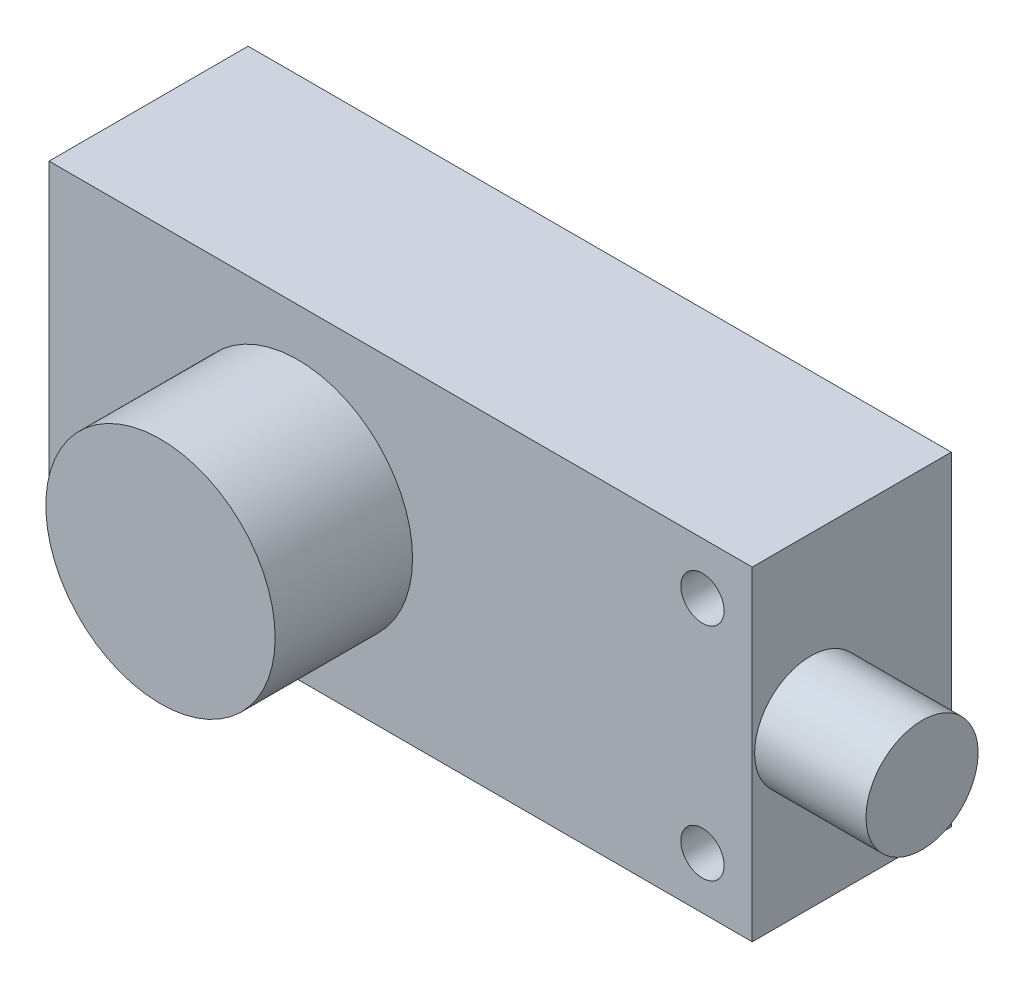
ISO-10303-21;
HEADER;
FILE_DESCRIPTION(('STEP AP214'),'2;1');
FILE_NAME('part.step','',(''),(''),'','','');
FILE_SCHEMA(('AUTOMOTIVE_DESIGN { 1 0 10303 214 1 1 1 1 }'));
ENDSEC;
DATA;
#1=APPLICATION_CONTEXT('core data for automotive mechanical design processes');
#2=APPLICATION_PROTOCOL_DEFINITION('international standard','automotive_design',2000,#1);
#3=PRODUCT_CONTEXT('',#1,'mechanical');
#4=PRODUCT('Part','Part','',(#3));
#5=PRODUCT_RELATED_PRODUCT_CATEGORY('part','',(#4));
#6=PRODUCT_DEFINITION_FORMATION('','',#4);
#7=PRODUCT_DEFINITION_CONTEXT('part definition',#1,'design');
#8=PRODUCT_DEFINITION('design','',#6,#7);
#9=PRODUCT_DEFINITION_SHAPE('','',#8);
#10=(LENGTH_UNIT() NAMED_UNIT(*) SI_UNIT(.MILLI.,.METRE.));
#11=(NAMED_UNIT(*) PLANE_ANGLE_UNIT() SI_UNIT($,.RADIAN.));
#12=(NAMED_UNIT(*) SI_UNIT($,.STERADIAN.) SOLID_ANGLE_UNIT());
#13=UNCERTAINTY_MEASURE_WITH_UNIT(LENGTH_MEASURE(1.E-05),#10,'distance_accuracy_value','');
#14=(GEOMETRIC_REPRESENTATION_CONTEXT(3) GLOBAL_UNCERTAINTY_ASSIGNED_CONTEXT((#13)) GLOBAL_UNIT_ASSIGNED_CONTEXT((#10,
#11,#12)) REPRESENTATION_CONTEXT('',''));
#15=CARTESIAN_POINT('',(0.,0.,0.));
#16=DIRECTION('',(0.,0.,1.));
#17=DIRECTION('',(1.,0.,0.));
#18=AXIS2_PLACEMENT_3D('',#15,#16,#17);
#19=CARTESIAN_POINT('',(-32.5,-15.,18.4));
#20=DIRECTION('',(1.,0.,0.));
#21=DIRECTION('',(0.,0.,-1.));
#22=AXIS2_PLACEMENT_3D('',#19,#20,#21);
#23=PLANE('',#22);
#24=DIRECTION('',(0.,-1.,0.));
#25=VECTOR('',#24,1.);
#26=CARTESIAN_POINT('',(-32.5,-15.,0.));
#27=LINE('',#26,#25);
#28=CARTESIAN_POINT('',(-32.5,15.,0.));
#29=VERTEX_POINT('',#28);
#30=CARTESIAN_POINT('',(-32.5,-15.,0.));
#31=VERTEX_POINT('',#30);
#32=EDGE_CURVE('E99',#29,#31,#27,.T.);
#33=ORIENTED_EDGE('',*,*,#32,.T.);
#34=DIRECTION('',(0.,0.,-1.));
#35=VECTOR('',#34,1.);
#36=CARTESIAN_POINT('',(-32.5,-15.,18.4));
#37=LINE('',#36,#35);
#38=CARTESIAN_POINT('',(-32.5,-15.,18.4));
#39=VERTEX_POINT('',#38);
#40=EDGE_CURVE('E41',#39,#31,#37,.T.);
#41=ORIENTED_EDGE('',*,*,#40,.F.);
#42=DIRECTION('',(0.,-1.,0.));
#43=VECTOR('',#42,1.);
#44=CARTESIAN_POINT('',(-32.5,-15.,18.4));
#45=LINE('',#44,#43);
#46=CARTESIAN_POINT('',(-32.5,15.,18.4));
#47=VERTEX_POINT('',#46);
#48=EDGE_CURVE('E85',#47,#39,#45,.T.);
#49=ORIENTED_EDGE('',*,*,#48,.F.);
#50=DIRECTION('',(0.,0.,-1.));
#51=VECTOR('',#50,1.);
#52=CARTESIAN_POINT('',(-32.5,15.,18.4));
#53=LINE('',#52,#51);
#54=EDGE_CURVE('E95',#47,#29,#53,.T.);
#55=ORIENTED_EDGE('',*,*,#54,.T.);
#56=EDGE_LOOP('',(#33,#41,#49,#55));
#57=FACE_BOUND('',#56,.T.);
#58=ADVANCED_FACE('F33',(#57),#23,.F.);
#59=CARTESIAN_POINT('',(32.5,-15.,18.4));
#60=DIRECTION('',(0.,1.,0.));
#61=DIRECTION('',(-1.,0.,0.));
#62=AXIS2_PLACEMENT_3D('',#59,#60,#61);
#63=PLANE('',#62);
#64=DIRECTION('',(1.,0.,0.));
#65=VECTOR('',#64,1.);
#66=CARTESIAN_POINT('',(32.5,-15.,0.));
#67=LINE('',#66,#65);
#68=CARTESIAN_POINT('',(32.5,-15.,0.));
#69=VERTEX_POINT('',#68);
#70=EDGE_CURVE('E90',#31,#69,#67,.T.);
#71=ORIENTED_EDGE('',*,*,#70,.T.);
#72=DIRECTION('',(0.,0.,-1.));
#73=VECTOR('',#72,1.);
#74=CARTESIAN_POINT('',(32.5,-15.,18.4));
#75=LINE('',#74,#73);
#76=CARTESIAN_POINT('',(32.5,-15.,18.4));
#77=VERTEX_POINT('',#76);
#78=EDGE_CURVE('E88',#77,#69,#75,.T.);
#79=ORIENTED_EDGE('',*,*,#78,.F.);
#80=DIRECTION('',(1.,0.,0.));
#81=VECTOR('',#80,1.);
#82=CARTESIAN_POINT('',(32.5,-15.,18.4));
#83=LINE('',#82,#81);
#84=EDGE_CURVE('E80',#39,#77,#83,.T.);
#85=ORIENTED_EDGE('',*,*,#84,.F.);
#86=ORIENTED_EDGE('',*,*,#40,.T.);
#87=EDGE_LOOP('',(#71,#79,#85,#86));
#88=FACE_BOUND('',#87,.T.);
#89=ADVANCED_FACE('F89',(#88),#63,.F.);
#90=CARTESIAN_POINT('',(32.5,-15.,18.4));
#91=DIRECTION('',(-1.,0.,0.));
#92=DIRECTION('',(0.,0.,1.));
#93=AXIS2_PLACEMENT_3D('',#90,#91,#92);
#94=PLANE('',#93);
#95=CARTESIAN_POINT('',(32.5,0.,13.));
#96=DIRECTION('',(-1.,0.,0.));
#97=DIRECTION('',(0.,0.,1.));
#98=AXIS2_PLACEMENT_3D('',#95,#96,#97);
#99=CIRCLE('',#98,5.18);
#100=CARTESIAN_POINT('',(32.5,0.,18.18));
#101=VERTEX_POINT('',#100);
#102=EDGE_CURVE('E11',#101,#101,#99,.F.);
#103=ORIENTED_EDGE('',*,*,#102,.F.);
#104=EDGE_LOOP('',(#103));
#105=FACE_BOUND('',#104,.T.);
#106=DIRECTION('',(0.,1.,0.));
#107=VECTOR('',#106,1.);
#108=CARTESIAN_POINT('',(32.5,-15.,0.));
#109=LINE('',#108,#107);
#110=CARTESIAN_POINT('',(32.5,15.,0.));
#111=VERTEX_POINT('',#110);
#112=EDGE_CURVE('E66',#69,#111,#109,.T.);
#113=ORIENTED_EDGE('',*,*,#112,.T.);
#114=DIRECTION('',(0.,0.,-1.));
#115=VECTOR('',#114,1.);
#116=CARTESIAN_POINT('',(32.5,15.,18.4));
#117=LINE('',#116,#115);
#118=CARTESIAN_POINT('',(32.5,15.,18.4));
#119=VERTEX_POINT('',#118);
#120=EDGE_CURVE('E91',#119,#111,#117,.T.);
#121=ORIENTED_EDGE('',*,*,#120,.F.);
#122=DIRECTION('',(0.,1.,0.));
#123=VECTOR('',#122,1.);
#124=CARTESIAN_POINT('',(32.5,-15.,18.4));
#125=LINE('',#124,#123);
#126=EDGE_CURVE('E83',#77,#119,#125,.T.);
#127=ORIENTED_EDGE('',*,*,#126,.F.);
#128=ORIENTED_EDGE('',*,*,#78,.T.);
#129=EDGE_LOOP('',(#113,#121,#127,#128));
#130=FACE_BOUND('',#129,.T.);
#131=ADVANCED_FACE('F93',(#105,#130),#94,.F.);
#132=CARTESIAN_POINT('',(32.5,15.,18.4));
#133=DIRECTION('',(0.,-1.,0.));
#134=DIRECTION('',(1.,0.,0.));
#135=AXIS2_PLACEMENT_3D('',#132,#133,#134);
#136=PLANE('',#135);
#137=DIRECTION('',(-1.,0.,0.));
#138=VECTOR('',#137,1.);
#139=CARTESIAN_POINT('',(32.5,15.,0.));
#140=LINE('',#139,#138);
#141=EDGE_CURVE('E72',#111,#29,#140,.T.);
#142=ORIENTED_EDGE('',*,*,#141,.T.);
#143=ORIENTED_EDGE('',*,*,#54,.F.);
#144=DIRECTION('',(-1.,0.,0.));
#145=VECTOR('',#144,1.);
#146=CARTESIAN_POINT('',(32.5,15.,18.4));
#147=LINE('',#146,#145);
#148=EDGE_CURVE('E49',#119,#47,#147,.T.);
#149=ORIENTED_EDGE('',*,*,#148,.F.);
#150=ORIENTED_EDGE('',*,*,#120,.T.);
#151=EDGE_LOOP('',(#142,#143,#149,#150));
#152=FACE_BOUND('',#151,.T.);
#153=ADVANCED_FACE('F122',(#152),#136,.F.);
#154=CARTESIAN_POINT('',(0.,0.,18.4));
#155=DIRECTION('',(0.,0.,1.));
#156=DIRECTION('',(1.,0.,0.));
#157=AXIS2_PLACEMENT_3D('',#154,#155,#156);
#158=PLANE('',#157);
#159=CARTESIAN_POINT('',(27.9,10.2,18.4));
#160=DIRECTION('',(0.,0.,1.));
#161=DIRECTION('',(1.,0.,0.));
#162=AXIS2_PLACEMENT_3D('',#159,#160,#161);
#163=CIRCLE('',#162,2.);
#164=CARTESIAN_POINT('',(29.9,10.2,18.4));
#165=VERTEX_POINT('',#164);
#166=EDGE_CURVE('E215',#165,#165,#163,.T.);
#167=ORIENTED_EDGE('',*,*,#166,.F.);
#168=EDGE_LOOP('',(#167));
#169=FACE_BOUND('',#168,.T.);
#170=CARTESIAN_POINT('',(27.9,-10.2,18.4));
#171=DIRECTION('',(0.,0.,1.));
#172=DIRECTION('',(1.,0.,0.));
#173=AXIS2_PLACEMENT_3D('',#170,#171,#172);
#174=CIRCLE('',#173,2.);
#175=CARTESIAN_POINT('',(29.9,-10.2,18.4));
#176=VERTEX_POINT('',#175);
#177=EDGE_CURVE('E209',#176,#176,#174,.T.);
#178=ORIENTED_EDGE('',*,*,#177,.F.);
#179=EDGE_LOOP('',(#178));
#180=FACE_BOUND('',#179,.T.);
#181=CARTESIAN_POINT('',(-9.5,0.,18.4));
#182=DIRECTION('',(0.,0.,1.));
#183=DIRECTION('',(1.,0.,0.));
#184=AXIS2_PLACEMENT_3D('',#181,#182,#183);
#185=CIRCLE('',#184,10.6);
#186=CARTESIAN_POINT('',(1.1,0.,18.4));
#187=VERTEX_POINT('',#186);
#188=EDGE_CURVE('E203',#187,#187,#185,.T.);
#189=ORIENTED_EDGE('',*,*,#188,.F.);
#190=EDGE_LOOP('',(#189));
#191=FACE_BOUND('',#190,.T.);
#192=ORIENTED_EDGE('',*,*,#48,.T.);
#193=ORIENTED_EDGE('',*,*,#84,.T.);
#194=ORIENTED_EDGE('',*,*,#126,.T.);
#195=ORIENTED_EDGE('',*,*,#148,.T.);
#196=EDGE_LOOP('',(#192,#193,#194,#195));
#197=FACE_BOUND('',#196,.T.);
#198=ADVANCED_FACE('F81',(#169,#180,#191,#197),#158,.T.);
#199=CARTESIAN_POINT('',(0.,0.,0.));
#200=DIRECTION('',(0.,0.,1.));
#201=DIRECTION('',(1.,0.,0.));
#202=AXIS2_PLACEMENT_3D('',#199,#200,#201);
#203=PLANE('',#202);
#204=CARTESIAN_POINT('',(27.9,10.2,0.));
#205=DIRECTION('',(0.,0.,1.));
#206=DIRECTION('',(1.,0.,0.));
#207=AXIS2_PLACEMENT_3D('',#204,#205,#206);
#208=CIRCLE('',#207,2.);
#209=CARTESIAN_POINT('',(29.9,10.2,0.));
#210=VERTEX_POINT('',#209);
#211=EDGE_CURVE('E212',#210,#210,#208,.T.);
#212=ORIENTED_EDGE('',*,*,#211,.T.);
#213=EDGE_LOOP('',(#212));
#214=FACE_BOUND('',#213,.T.);
#215=CARTESIAN_POINT('',(27.9,-10.2,0.));
#216=DIRECTION('',(0.,0.,1.));
#217=DIRECTION('',(1.,0.,0.));
#218=AXIS2_PLACEMENT_3D('',#215,#216,#217);
#219=CIRCLE('',#218,2.);
#220=CARTESIAN_POINT('',(29.9,-10.2,0.));
#221=VERTEX_POINT('',#220);
#222=EDGE_CURVE('E206',#221,#221,#219,.T.);
#223=ORIENTED_EDGE('',*,*,#222,.T.);
#224=EDGE_LOOP('',(#223));
#225=FACE_BOUND('',#224,.T.);
#226=ORIENTED_EDGE('',*,*,#32,.F.);
#227=ORIENTED_EDGE('',*,*,#141,.F.);
#228=ORIENTED_EDGE('',*,*,#112,.F.);
#229=ORIENTED_EDGE('',*,*,#70,.F.);
#230=EDGE_LOOP('',(#226,#227,#228,#229));
#231=FACE_BOUND('',#230,.T.);
#232=ADVANCED_FACE('F110',(#214,#225,#231),#203,.F.);
#233=CARTESIAN_POINT('',(-9.5,0.,31.1));
#234=DIRECTION('',(0.,0.,-1.));
#235=DIRECTION('',(-1.,0.,0.));
#236=AXIS2_PLACEMENT_3D('',#233,#234,#235);
#237=CYLINDRICAL_SURFACE('',#236,10.6);
#238=CARTESIAN_POINT('',(-9.5,0.,31.1));
#239=DIRECTION('',(0.,0.,1.));
#240=DIRECTION('',(1.,0.,0.));
#241=AXIS2_PLACEMENT_3D('',#238,#239,#240);
#242=CIRCLE('',#241,10.6);
#243=CARTESIAN_POINT('',(1.1,0.,31.1));
#244=VERTEX_POINT('',#243);
#245=EDGE_CURVE('E102',#244,#244,#242,.T.);
#246=ORIENTED_EDGE('',*,*,#245,.F.);
#247=EDGE_LOOP('',(#246));
#248=FACE_BOUND('',#247,.T.);
#249=ORIENTED_EDGE('',*,*,#188,.T.);
#250=EDGE_LOOP('',(#249));
#251=FACE_BOUND('',#250,.T.);
#252=ADVANCED_FACE('F112',(#248,#251),#237,.T.);
#253=CARTESIAN_POINT('',(-9.5,0.,31.1));
#254=DIRECTION('',(0.,0.,1.));
#255=DIRECTION('',(1.,0.,0.));
#256=AXIS2_PLACEMENT_3D('',#253,#254,#255);
#257=PLANE('',#256);
#258=ORIENTED_EDGE('',*,*,#245,.T.);
#259=EDGE_LOOP('',(#258));
#260=FACE_BOUND('',#259,.T.);
#261=ADVANCED_FACE('F119',(#260),#257,.T.);
#262=CARTESIAN_POINT('',(27.9,-10.2,0.));
#263=DIRECTION('',(0.,0.,1.));
#264=DIRECTION('',(1.,0.,0.));
#265=AXIS2_PLACEMENT_3D('',#262,#263,#264);
#266=CYLINDRICAL_SURFACE('',#265,2.);
#267=ORIENTED_EDGE('',*,*,#222,.F.);
#268=EDGE_LOOP('',(#267));
#269=FACE_BOUND('',#268,.T.);
#270=ORIENTED_EDGE('',*,*,#177,.T.);
#271=EDGE_LOOP('',(#270));
#272=FACE_BOUND('',#271,.T.);
#273=ADVANCED_FACE('F154',(#269,#272),#266,.F.);
#274=CARTESIAN_POINT('',(27.9,10.2,0.));
#275=DIRECTION('',(0.,0.,1.));
#276=DIRECTION('',(1.,0.,0.));
#277=AXIS2_PLACEMENT_3D('',#274,#275,#276);
#278=CYLINDRICAL_SURFACE('',#277,2.);
#279=ORIENTED_EDGE('',*,*,#211,.F.);
#280=EDGE_LOOP('',(#279));
#281=FACE_BOUND('',#280,.T.);
#282=ORIENTED_EDGE('',*,*,#166,.T.);
#283=EDGE_LOOP('',(#282));
#284=FACE_BOUND('',#283,.T.);
#285=ADVANCED_FACE('F164',(#281,#284),#278,.F.);
#286=CARTESIAN_POINT('',(42.8,0.,13.));
#287=DIRECTION('',(-1.,0.,0.));
#288=DIRECTION('',(0.,0.,1.));
#289=AXIS2_PLACEMENT_3D('',#286,#287,#288);
#290=CYLINDRICAL_SURFACE('',#289,5.18);
#291=CARTESIAN_POINT('',(42.8,0.,13.));
#292=DIRECTION('',(1.,0.,0.));
#293=DIRECTION('',(0.,0.,-1.));
#294=AXIS2_PLACEMENT_3D('',#291,#292,#293);
#295=CIRCLE('',#294,5.18);
#296=CARTESIAN_POINT('',(42.8,0.,18.18));
#297=VERTEX_POINT('',#296);
#298=EDGE_CURVE('E218',#297,#297,#295,.T.);
#299=CARTESIAN_POINT('',(42.8,0.,18.18));
#300=CARTESIAN_POINT('',(42.6927083333333,0.,18.18));
#301=CARTESIAN_POINT('',(42.5854166666667,0.,18.18));
#302=CARTESIAN_POINT('',(42.3708333333333,0.,18.18));
#303=CARTESIAN_POINT('',(42.2635416666667,0.,18.18));
#304=CARTESIAN_POINT('',(42.0489583333333,0.,18.18));
#305=CARTESIAN_POINT('',(41.9416666666667,0.,18.18));
#306=CARTESIAN_POINT('',(41.7270833333333,0.,18.18));
#307=CARTESIAN_POINT('',(41.6197916666667,0.,18.18));
#308=CARTESIAN_POINT('',(41.4052083333333,0.,18.18));
#309=CARTESIAN_POINT('',(41.2979166666667,0.,18.18));
#310=CARTESIAN_POINT('',(41.0833333333333,0.,18.18));
#311=CARTESIAN_POINT('',(40.9760416666667,0.,18.18));
#312=CARTESIAN_POINT('',(40.7614583333333,0.,18.18));
#313=CARTESIAN_POINT('',(40.6541666666667,0.,18.18));
#314=CARTESIAN_POINT('',(40.4395833333333,0.,18.18));
#315=CARTESIAN_POINT('',(40.3322916666667,0.,18.18));
#316=CARTESIAN_POINT('',(40.1177083333333,0.,18.18));
#317=CARTESIAN_POINT('',(40.0104166666667,0.,18.18));
#318=CARTESIAN_POINT('',(39.7958333333333,0.,18.18));
#319=CARTESIAN_POINT('',(39.6885416666667,0.,18.18));
#320=CARTESIAN_POINT('',(39.4739583333333,0.,18.18));
#321=CARTESIAN_POINT('',(39.3666666666667,0.,18.18));
#322=CARTESIAN_POINT('',(39.1520833333333,0.,18.18));
#323=CARTESIAN_POINT('',(39.0447916666667,0.,18.18));
#324=CARTESIAN_POINT('',(38.8302083333333,0.,18.18));
#325=CARTESIAN_POINT('',(38.7229166666667,0.,18.18));
#326=CARTESIAN_POINT('',(38.5083333333333,0.,18.18));
#327=CARTESIAN_POINT('',(38.4010416666667,0.,18.18));
#328=CARTESIAN_POINT('',(38.1864583333333,0.,18.18));
#329=CARTESIAN_POINT('',(38.0791666666667,0.,18.18));
#330=CARTESIAN_POINT('',(37.8645833333333,0.,18.18));
#331=CARTESIAN_POINT('',(37.7572916666667,0.,18.18));
#332=CARTESIAN_POINT('',(37.5427083333333,0.,18.18));
#333=CARTESIAN_POINT('',(37.4354166666667,0.,18.18));
#334=CARTESIAN_POINT('',(37.2208333333333,0.,18.18));
#335=CARTESIAN_POINT('',(37.1135416666667,0.,18.18));
#336=CARTESIAN_POINT('',(36.8989583333333,0.,18.18));
#337=CARTESIAN_POINT('',(36.7916666666667,0.,18.18));
#338=CARTESIAN_POINT('',(36.5770833333333,0.,18.18));
#339=CARTESIAN_POINT('',(36.4697916666667,0.,18.18));
#340=CARTESIAN_POINT('',(36.2552083333333,0.,18.18));
#341=CARTESIAN_POINT('',(36.1479166666667,0.,18.18));
#342=CARTESIAN_POINT('',(35.9333333333333,0.,18.18));
#343=CARTESIAN_POINT('',(35.8260416666667,0.,18.18));
#344=CARTESIAN_POINT('',(35.6114583333333,0.,18.18));
#345=CARTESIAN_POINT('',(35.5041666666667,0.,18.18));
#346=CARTESIAN_POINT('',(35.2895833333333,0.,18.18));
#347=CARTESIAN_POINT('',(35.1822916666667,0.,18.18));
#348=CARTESIAN_POINT('',(34.9677083333333,0.,18.18));
#349=CARTESIAN_POINT('',(34.8604166666667,0.,18.18));
#350=CARTESIAN_POINT('',(34.6458333333333,0.,18.18));
#351=CARTESIAN_POINT('',(34.5385416666667,0.,18.18));
#352=CARTESIAN_POINT('',(34.3239583333333,0.,18.18));
#353=CARTESIAN_POINT('',(34.2166666666667,0.,18.18));
#354=CARTESIAN_POINT('',(34.0020833333333,0.,18.18));
#355=CARTESIAN_POINT('',(33.8947916666667,0.,18.18));
#356=CARTESIAN_POINT('',(33.6802083333333,0.,18.18));
#357=CARTESIAN_POINT('',(33.5729166666667,0.,18.18));
#358=CARTESIAN_POINT('',(33.3583333333333,0.,18.18));
#359=CARTESIAN_POINT('',(33.2510416666667,0.,18.18));
#360=CARTESIAN_POINT('',(33.0364583333333,0.,18.18));
#361=CARTESIAN_POINT('',(32.9291666666667,0.,18.18));
#362=CARTESIAN_POINT('',(32.7145833333333,0.,18.18));
#363=CARTESIAN_POINT('',(32.6072916666667,0.,18.18));
#364=CARTESIAN_POINT('',(32.5,0.,18.18));
#365=B_SPLINE_CURVE_WITH_KNOTS('',3,(#299,#300,#301,#302,#303,#304,#305,#306,#307,#308,#309,
#310,#311,#312,#313,#314,#315,#316,#317,#318,#319,#320,#321,#322,#323,#324,#325,#326,#327,#328,
#329,#330,#331,#332,#333,#334,#335,#336,#337,#338,#339,#340,#341,#342,#343,#344,#345,#346,#347,
#348,#349,#350,#351,#352,#353,#354,#355,#356,#357,#358,#359,#360,#361,#362,#363,#364),
.UNSPECIFIED.,.F.,.F.,(4,2,2,2,2,2,2,2,2,2,2,2,2,2,2,2,2,2,2,2,2,2,2,2,2,2,2,2,2,2,2,2,4),(0.,
0.321874999999999,0.643749999999998,0.965624999999998,1.2875,1.609375,1.93125,2.25312499999999,
2.57499999999999,2.89687499999999,3.21874999999999,3.54062499999999,3.86249999999999,
4.18437499999999,4.50625,4.828125,5.15,5.47187499999999,5.79374999999999,6.11562499999999,
6.43749999999999,6.75937499999999,7.08124999999999,7.40312499999999,7.72499999999999,
8.04687499999999,8.36874999999999,8.69062499999999,9.01249999999999,9.33437499999999,
9.65624999999998,9.97812499999999,10.3),.UNSPECIFIED.);
#366=EDGE_CURVE('BSEAM168',#297,#101,#365,.T.);
#367=ORIENTED_EDGE('',*,*,#298,.F.);
#368=ORIENTED_EDGE('',*,*,#102,.T.);
#369=ORIENTED_EDGE('',*,*,#366,.T.);
#370=ORIENTED_EDGE('',*,*,#366,.F.);
#371=EDGE_LOOP('',(#367,#369,#368,#370));
#372=FACE_BOUND('',#371,.T.);
#373=ADVANCED_FACE('F168',(#372),#290,.T.);
#374=CARTESIAN_POINT('',(42.8,0.,13.));
#375=DIRECTION('',(1.,0.,0.));
#376=DIRECTION('',(0.,0.,-1.));
#377=AXIS2_PLACEMENT_3D('',#374,#375,#376);
#378=PLANE('',#377);
#379=ORIENTED_EDGE('',*,*,#298,.T.);
#380=EDGE_LOOP('',(#379));
#381=FACE_BOUND('',#380,.T.);
#382=ADVANCED_FACE('F180',(#381),#378,.T.);
#383=CLOSED_SHELL('',(#58,#89,#131,#153,#198,#232,#252,#261,#273,#285,#373,#382));
#384=MANIFOLD_SOLID_BREP('B2',#383);
#385=ADVANCED_BREP_SHAPE_REPRESENTATION('',(#18,#384),#14);
#386=SHAPE_DEFINITION_REPRESENTATION(#9,#385);
ENDSEC;
END-ISO-10303-21;
